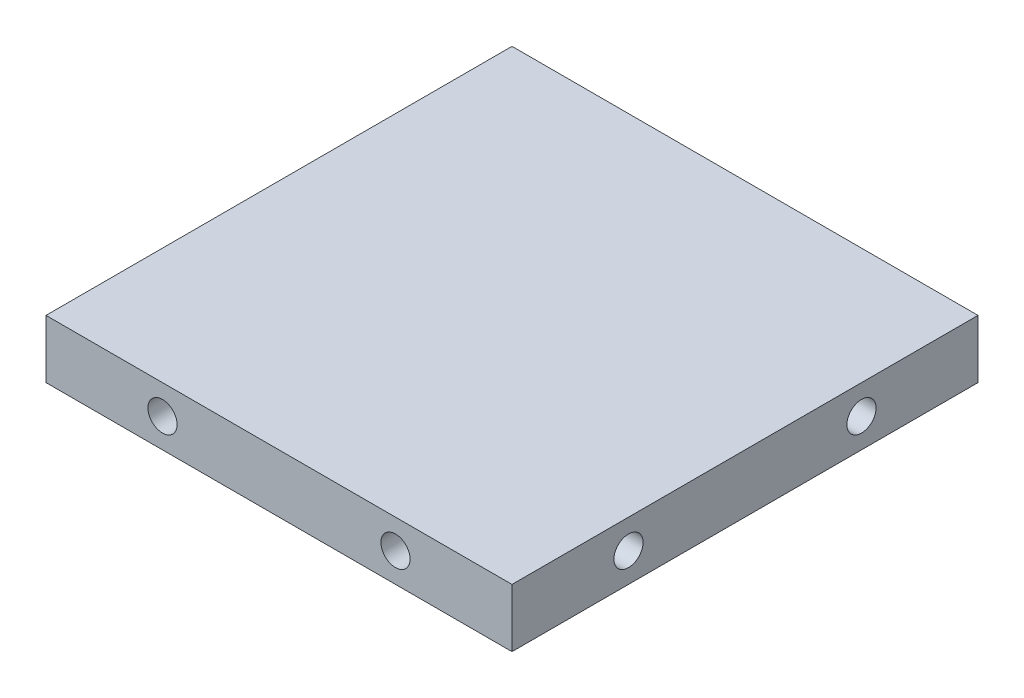
ISO-10303-21;
HEADER;
FILE_DESCRIPTION(('STEP AP214'),'2;1');
FILE_NAME('part.step','',(''),(''),'','','');
FILE_SCHEMA(('AUTOMOTIVE_DESIGN { 1 0 10303 214 1 1 1 1 }'));
ENDSEC;
DATA;
#1=APPLICATION_CONTEXT('core data for automotive mechanical design processes');
#2=APPLICATION_PROTOCOL_DEFINITION('international standard','automotive_design',2000,#1);
#3=PRODUCT_CONTEXT('',#1,'mechanical');
#4=PRODUCT('Part','Part','',(#3));
#5=PRODUCT_RELATED_PRODUCT_CATEGORY('part','',(#4));
#6=PRODUCT_DEFINITION_FORMATION('','',#4);
#7=PRODUCT_DEFINITION_CONTEXT('part definition',#1,'design');
#8=PRODUCT_DEFINITION('design','',#6,#7);
#9=PRODUCT_DEFINITION_SHAPE('','',#8);
#10=(LENGTH_UNIT() NAMED_UNIT(*) SI_UNIT(.MILLI.,.METRE.));
#11=(NAMED_UNIT(*) PLANE_ANGLE_UNIT() SI_UNIT($,.RADIAN.));
#12=(NAMED_UNIT(*) SI_UNIT($,.STERADIAN.) SOLID_ANGLE_UNIT());
#13=UNCERTAINTY_MEASURE_WITH_UNIT(LENGTH_MEASURE(1.E-05),#10,'distance_accuracy_value','');
#14=(GEOMETRIC_REPRESENTATION_CONTEXT(3) GLOBAL_UNCERTAINTY_ASSIGNED_CONTEXT((#13)) GLOBAL_UNIT_ASSIGNED_CONTEXT((#10,
#11,#12)) REPRESENTATION_CONTEXT('',''));
#15=CARTESIAN_POINT('',(0.,0.,0.));
#16=DIRECTION('',(0.,0.,1.));
#17=DIRECTION('',(1.,0.,0.));
#18=AXIS2_PLACEMENT_3D('',#15,#16,#17);
#19=CARTESIAN_POINT('',(20.,5.,20.));
#20=DIRECTION('',(-1.,0.,0.));
#21=DIRECTION('',(0.,0.,1.));
#22=AXIS2_PLACEMENT_3D('',#19,#20,#21);
#23=PLANE('',#22);
#24=CARTESIAN_POINT('',(20.,2.5,-10.0000000000001));
#25=DIRECTION('',(1.,0.,0.));
#26=DIRECTION('',(0.,0.,1.));
#27=AXIS2_PLACEMENT_3D('',#24,#25,#26);
#28=CIRCLE('',#27,1.25);
#29=CARTESIAN_POINT('',(20.,2.5,-8.75000000000007));
#30=VERTEX_POINT('',#29);
#31=EDGE_CURVE('E190',#30,#30,#28,.T.);
#32=ORIENTED_EDGE('',*,*,#31,.F.);
#33=EDGE_LOOP('',(#32));
#34=FACE_BOUND('',#33,.T.);
#35=CARTESIAN_POINT('',(20.,2.5,9.99999999999993));
#36=DIRECTION('',(1.,0.,0.));
#37=DIRECTION('',(0.,0.,-1.));
#38=AXIS2_PLACEMENT_3D('',#35,#36,#37);
#39=CIRCLE('',#38,1.25);
#40=CARTESIAN_POINT('',(20.,2.5,8.74999999999993));
#41=VERTEX_POINT('',#40);
#42=EDGE_CURVE('E150',#41,#41,#39,.T.);
#43=ORIENTED_EDGE('',*,*,#42,.F.);
#44=EDGE_LOOP('',(#43));
#45=FACE_BOUND('',#44,.T.);
#46=DIRECTION('',(0.,0.,-1.));
#47=VECTOR('',#46,1.);
#48=CARTESIAN_POINT('',(20.,0.,20.));
#49=LINE('',#48,#47);
#50=CARTESIAN_POINT('',(20.,0.,20.));
#51=VERTEX_POINT('',#50);
#52=CARTESIAN_POINT('',(20.,0.,-20.));
#53=VERTEX_POINT('',#52);
#54=EDGE_CURVE('E113',#51,#53,#49,.T.);
#55=ORIENTED_EDGE('',*,*,#54,.T.);
#56=DIRECTION('',(0.,-1.,0.));
#57=VECTOR('',#56,1.);
#58=CARTESIAN_POINT('',(20.,5.,-20.));
#59=LINE('',#58,#57);
#60=CARTESIAN_POINT('',(20.,5.,-20.));
#61=VERTEX_POINT('',#60);
#62=EDGE_CURVE('E11',#61,#53,#59,.T.);
#63=ORIENTED_EDGE('',*,*,#62,.F.);
#64=DIRECTION('',(0.,0.,-1.));
#65=VECTOR('',#64,1.);
#66=CARTESIAN_POINT('',(20.,5.,20.));
#67=LINE('',#66,#65);
#68=CARTESIAN_POINT('',(20.,5.,20.));
#69=VERTEX_POINT('',#68);
#70=EDGE_CURVE('E97',#69,#61,#67,.T.);
#71=ORIENTED_EDGE('',*,*,#70,.F.);
#72=DIRECTION('',(0.,-1.,0.));
#73=VECTOR('',#72,1.);
#74=CARTESIAN_POINT('',(20.,5.,20.));
#75=LINE('',#74,#73);
#76=EDGE_CURVE('E109',#69,#51,#75,.T.);
#77=ORIENTED_EDGE('',*,*,#76,.T.);
#78=EDGE_LOOP('',(#55,#63,#71,#77));
#79=FACE_BOUND('',#78,.T.);
#80=ADVANCED_FACE('F45',(#34,#45,#79),#23,.F.);
#81=CARTESIAN_POINT('',(-20.,5.,-20.));
#82=DIRECTION('',(0.,0.,1.));
#83=DIRECTION('',(1.,0.,0.));
#84=AXIS2_PLACEMENT_3D('',#81,#82,#83);
#85=PLANE('',#84);
#86=CARTESIAN_POINT('',(-10.,2.5,-20.));
#87=DIRECTION('',(0.,0.,-1.));
#88=DIRECTION('',(1.,0.,0.));
#89=AXIS2_PLACEMENT_3D('',#86,#87,#88);
#90=CIRCLE('',#89,1.25);
#91=CARTESIAN_POINT('',(-8.75,2.5,-20.));
#92=VERTEX_POINT('',#91);
#93=EDGE_CURVE('E174',#92,#92,#90,.T.);
#94=ORIENTED_EDGE('',*,*,#93,.F.);
#95=EDGE_LOOP('',(#94));
#96=FACE_BOUND('',#95,.T.);
#97=CARTESIAN_POINT('',(10.,2.5,-20.));
#98=DIRECTION('',(0.,0.,-1.));
#99=DIRECTION('',(-1.,0.,0.));
#100=AXIS2_PLACEMENT_3D('',#97,#98,#99);
#101=CIRCLE('',#100,1.25);
#102=CARTESIAN_POINT('',(8.75,2.5,-20.));
#103=VERTEX_POINT('',#102);
#104=EDGE_CURVE('E182',#103,#103,#101,.T.);
#105=ORIENTED_EDGE('',*,*,#104,.F.);
#106=EDGE_LOOP('',(#105));
#107=FACE_BOUND('',#106,.T.);
#108=DIRECTION('',(-1.,0.,0.));
#109=VECTOR('',#108,1.);
#110=CARTESIAN_POINT('',(-20.,0.,-20.));
#111=LINE('',#110,#109);
#112=CARTESIAN_POINT('',(-20.,0.,-20.));
#113=VERTEX_POINT('',#112);
#114=EDGE_CURVE('E102',#53,#113,#111,.T.);
#115=ORIENTED_EDGE('',*,*,#114,.T.);
#116=DIRECTION('',(0.,-1.,0.));
#117=VECTOR('',#116,1.);
#118=CARTESIAN_POINT('',(-20.,5.,-20.));
#119=LINE('',#118,#117);
#120=CARTESIAN_POINT('',(-20.,5.,-20.));
#121=VERTEX_POINT('',#120);
#122=EDGE_CURVE('E54',#121,#113,#119,.T.);
#123=ORIENTED_EDGE('',*,*,#122,.F.);
#124=DIRECTION('',(-1.,0.,0.));
#125=VECTOR('',#124,1.);
#126=CARTESIAN_POINT('',(-20.,5.,-20.));
#127=LINE('',#126,#125);
#128=EDGE_CURVE('E92',#61,#121,#127,.T.);
#129=ORIENTED_EDGE('',*,*,#128,.F.);
#130=ORIENTED_EDGE('',*,*,#62,.T.);
#131=EDGE_LOOP('',(#115,#123,#129,#130));
#132=FACE_BOUND('',#131,.T.);
#133=ADVANCED_FACE('F101',(#96,#107,#132),#85,.F.);
#134=CARTESIAN_POINT('',(-20.,5.,20.));
#135=DIRECTION('',(1.,0.,0.));
#136=DIRECTION('',(0.,0.,-1.));
#137=AXIS2_PLACEMENT_3D('',#134,#135,#136);
#138=PLANE('',#137);
#139=CARTESIAN_POINT('',(-19.9999999999999,2.5,10.0000000000002));
#140=DIRECTION('',(-1.,0.,0.));
#141=DIRECTION('',(0.,0.,-1.));
#142=AXIS2_PLACEMENT_3D('',#139,#140,#141);
#143=CIRCLE('',#142,1.25);
#144=CARTESIAN_POINT('',(-19.9999999999999,2.5,8.75000000000021));
#145=VERTEX_POINT('',#144);
#146=EDGE_CURVE('E158',#145,#145,#143,.T.);
#147=ORIENTED_EDGE('',*,*,#146,.F.);
#148=EDGE_LOOP('',(#147));
#149=FACE_BOUND('',#148,.T.);
#150=CARTESIAN_POINT('',(-20.0000000000001,2.5,-9.99999999999979));
#151=DIRECTION('',(-1.,0.,0.));
#152=DIRECTION('',(0.,0.,1.));
#153=AXIS2_PLACEMENT_3D('',#150,#151,#152);
#154=CIRCLE('',#153,1.25);
#155=CARTESIAN_POINT('',(-20.0000000000001,2.5,-8.74999999999979));
#156=VERTEX_POINT('',#155);
#157=EDGE_CURVE('E166',#156,#156,#154,.T.);
#158=ORIENTED_EDGE('',*,*,#157,.F.);
#159=EDGE_LOOP('',(#158));
#160=FACE_BOUND('',#159,.T.);
#161=DIRECTION('',(0.,0.,1.));
#162=VECTOR('',#161,1.);
#163=CARTESIAN_POINT('',(-20.,0.,20.));
#164=LINE('',#163,#162);
#165=CARTESIAN_POINT('',(-20.,0.,20.));
#166=VERTEX_POINT('',#165);
#167=EDGE_CURVE('E79',#113,#166,#164,.T.);
#168=ORIENTED_EDGE('',*,*,#167,.T.);
#169=DIRECTION('',(0.,-1.,0.));
#170=VECTOR('',#169,1.);
#171=CARTESIAN_POINT('',(-20.,5.,20.));
#172=LINE('',#171,#170);
#173=CARTESIAN_POINT('',(-20.,5.,20.));
#174=VERTEX_POINT('',#173);
#175=EDGE_CURVE('E104',#174,#166,#172,.T.);
#176=ORIENTED_EDGE('',*,*,#175,.F.);
#177=DIRECTION('',(0.,0.,1.));
#178=VECTOR('',#177,1.);
#179=CARTESIAN_POINT('',(-20.,5.,20.));
#180=LINE('',#179,#178);
#181=EDGE_CURVE('E95',#121,#174,#180,.T.);
#182=ORIENTED_EDGE('',*,*,#181,.F.);
#183=ORIENTED_EDGE('',*,*,#122,.T.);
#184=EDGE_LOOP('',(#168,#176,#182,#183));
#185=FACE_BOUND('',#184,.T.);
#186=ADVANCED_FACE('F105',(#149,#160,#185),#138,.F.);
#187=CARTESIAN_POINT('',(-20.,5.,20.));
#188=DIRECTION('',(0.,0.,-1.));
#189=DIRECTION('',(-1.,0.,0.));
#190=AXIS2_PLACEMENT_3D('',#187,#188,#189);
#191=PLANE('',#190);
#192=CARTESIAN_POINT('',(-10.,2.5,20.));
#193=DIRECTION('',(0.,0.,1.));
#194=DIRECTION('',(1.,0.,0.));
#195=AXIS2_PLACEMENT_3D('',#192,#193,#194);
#196=CIRCLE('',#195,1.25);
#197=CARTESIAN_POINT('',(-8.75,2.5,20.));
#198=VERTEX_POINT('',#197);
#199=EDGE_CURVE('E143',#198,#198,#196,.T.);
#200=ORIENTED_EDGE('',*,*,#199,.F.);
#201=EDGE_LOOP('',(#200));
#202=FACE_BOUND('',#201,.T.);
#203=CARTESIAN_POINT('',(10.,2.5,20.));
#204=DIRECTION('',(0.,0.,1.));
#205=DIRECTION('',(-1.,0.,0.));
#206=AXIS2_PLACEMENT_3D('',#203,#204,#205);
#207=CIRCLE('',#206,1.25);
#208=CARTESIAN_POINT('',(8.75,2.5,20.));
#209=VERTEX_POINT('',#208);
#210=EDGE_CURVE('E138',#209,#209,#207,.T.);
#211=ORIENTED_EDGE('',*,*,#210,.F.);
#212=EDGE_LOOP('',(#211));
#213=FACE_BOUND('',#212,.T.);
#214=DIRECTION('',(1.,0.,0.));
#215=VECTOR('',#214,1.);
#216=CARTESIAN_POINT('',(-20.,0.,20.));
#217=LINE('',#216,#215);
#218=EDGE_CURVE('E85',#166,#51,#217,.T.);
#219=ORIENTED_EDGE('',*,*,#218,.T.);
#220=ORIENTED_EDGE('',*,*,#76,.F.);
#221=DIRECTION('',(1.,0.,0.));
#222=VECTOR('',#221,1.);
#223=CARTESIAN_POINT('',(-20.,5.,20.));
#224=LINE('',#223,#222);
#225=EDGE_CURVE('E62',#174,#69,#224,.T.);
#226=ORIENTED_EDGE('',*,*,#225,.F.);
#227=ORIENTED_EDGE('',*,*,#175,.T.);
#228=EDGE_LOOP('',(#219,#220,#226,#227));
#229=FACE_BOUND('',#228,.T.);
#230=ADVANCED_FACE('F127',(#202,#213,#229),#191,.F.);
#231=CARTESIAN_POINT('',(0.,5.,0.));
#232=DIRECTION('',(0.,-1.,0.));
#233=DIRECTION('',(0.,0.,-1.));
#234=AXIS2_PLACEMENT_3D('',#231,#232,#233);
#235=PLANE('',#234);
#236=ORIENTED_EDGE('',*,*,#70,.T.);
#237=ORIENTED_EDGE('',*,*,#128,.T.);
#238=ORIENTED_EDGE('',*,*,#181,.T.);
#239=ORIENTED_EDGE('',*,*,#225,.T.);
#240=EDGE_LOOP('',(#236,#237,#238,#239));
#241=FACE_BOUND('',#240,.T.);
#242=ADVANCED_FACE('F93',(#241),#235,.F.);
#243=CARTESIAN_POINT('',(0.,0.,0.));
#244=DIRECTION('',(0.,-1.,0.));
#245=DIRECTION('',(0.,0.,-1.));
#246=AXIS2_PLACEMENT_3D('',#243,#244,#245);
#247=PLANE('',#246);
#248=ORIENTED_EDGE('',*,*,#54,.F.);
#249=ORIENTED_EDGE('',*,*,#218,.F.);
#250=ORIENTED_EDGE('',*,*,#167,.F.);
#251=ORIENTED_EDGE('',*,*,#114,.F.);
#252=EDGE_LOOP('',(#248,#249,#250,#251));
#253=FACE_BOUND('',#252,.T.);
#254=ADVANCED_FACE('F130',(#253),#247,.T.);
#255=CARTESIAN_POINT('',(10.,2.5,15.));
#256=DIRECTION('',(0.,0.,1.));
#257=DIRECTION('',(1.,0.,0.));
#258=AXIS2_PLACEMENT_3D('',#255,#256,#257);
#259=CYLINDRICAL_SURFACE('',#258,1.25);
#260=CARTESIAN_POINT('',(10.,2.5,15.));
#261=DIRECTION('',(0.,0.,1.));
#262=DIRECTION('',(-1.,0.,0.));
#263=AXIS2_PLACEMENT_3D('',#260,#261,#262);
#264=CIRCLE('',#263,1.25);
#265=CARTESIAN_POINT('',(8.75,2.5,15.));
#266=VERTEX_POINT('',#265);
#267=EDGE_CURVE('E134',#266,#266,#264,.T.);
#268=ORIENTED_EDGE('',*,*,#267,.F.);
#269=EDGE_LOOP('',(#268));
#270=FACE_BOUND('',#269,.T.);
#271=ORIENTED_EDGE('',*,*,#210,.T.);
#272=EDGE_LOOP('',(#271));
#273=FACE_BOUND('',#272,.T.);
#274=ADVANCED_FACE('F238',(#270,#273),#259,.F.);
#275=CARTESIAN_POINT('',(10.,2.5,15.));
#276=DIRECTION('',(0.,0.,-1.));
#277=DIRECTION('',(-1.,0.,0.));
#278=AXIS2_PLACEMENT_3D('',#275,#276,#277);
#279=PLANE('',#278);
#280=ORIENTED_EDGE('',*,*,#267,.T.);
#281=EDGE_LOOP('',(#280));
#282=FACE_BOUND('',#281,.T.);
#283=ADVANCED_FACE('F236',(#282),#279,.F.);
#284=CARTESIAN_POINT('',(-10.,2.5,15.));
#285=DIRECTION('',(0.,0.,1.));
#286=DIRECTION('',(1.,0.,0.));
#287=AXIS2_PLACEMENT_3D('',#284,#285,#286);
#288=CYLINDRICAL_SURFACE('',#287,1.25);
#289=CARTESIAN_POINT('',(-10.,2.5,15.));
#290=DIRECTION('',(0.,0.,1.));
#291=DIRECTION('',(1.,0.,0.));
#292=AXIS2_PLACEMENT_3D('',#289,#290,#291);
#293=CIRCLE('',#292,1.25);
#294=CARTESIAN_POINT('',(-8.75,2.5,15.));
#295=VERTEX_POINT('',#294);
#296=EDGE_CURVE('E117',#295,#295,#293,.T.);
#297=ORIENTED_EDGE('',*,*,#296,.F.);
#298=EDGE_LOOP('',(#297));
#299=FACE_BOUND('',#298,.T.);
#300=ORIENTED_EDGE('',*,*,#199,.T.);
#301=EDGE_LOOP('',(#300));
#302=FACE_BOUND('',#301,.T.);
#303=ADVANCED_FACE('F232',(#299,#302),#288,.F.);
#304=CARTESIAN_POINT('',(-10.,2.5,15.));
#305=DIRECTION('',(0.,0.,1.));
#306=DIRECTION('',(1.,0.,0.));
#307=AXIS2_PLACEMENT_3D('',#304,#305,#306);
#308=PLANE('',#307);
#309=ORIENTED_EDGE('',*,*,#296,.T.);
#310=EDGE_LOOP('',(#309));
#311=FACE_BOUND('',#310,.T.);
#312=ADVANCED_FACE('F228',(#311),#308,.T.);
#313=CARTESIAN_POINT('',(-15.0000000000001,2.5,-9.99999999999984));
#314=DIRECTION('',(-1.,0.,0.));
#315=DIRECTION('',(0.,0.,1.));
#316=AXIS2_PLACEMENT_3D('',#313,#314,#315);
#317=CYLINDRICAL_SURFACE('',#316,1.25);
#318=CARTESIAN_POINT('',(-15.0000000000001,2.5,-9.99999999999984));
#319=DIRECTION('',(-1.,0.,0.));
#320=DIRECTION('',(0.,0.,1.));
#321=AXIS2_PLACEMENT_3D('',#318,#319,#320);
#322=CIRCLE('',#321,1.25);
#323=CARTESIAN_POINT('',(-15.0000000000001,2.5,-8.74999999999984));
#324=VERTEX_POINT('',#323);
#325=EDGE_CURVE('E170',#324,#324,#322,.T.);
#326=ORIENTED_EDGE('',*,*,#325,.F.);
#327=EDGE_LOOP('',(#326));
#328=FACE_BOUND('',#327,.T.);
#329=ORIENTED_EDGE('',*,*,#157,.T.);
#330=EDGE_LOOP('',(#329));
#331=FACE_BOUND('',#330,.T.);
#332=ADVANCED_FACE('F231',(#328,#331),#317,.F.);
#333=CARTESIAN_POINT('',(-15.0000000000001,2.5,-9.99999999999984));
#334=DIRECTION('',(-1.,0.,0.));
#335=DIRECTION('',(0.,0.,1.));
#336=AXIS2_PLACEMENT_3D('',#333,#334,#335);
#337=PLANE('',#336);
#338=ORIENTED_EDGE('',*,*,#325,.T.);
#339=EDGE_LOOP('',(#338));
#340=FACE_BOUND('',#339,.T.);
#341=ADVANCED_FACE('F282',(#340),#337,.T.);
#342=CARTESIAN_POINT('',(-14.9999999999999,2.5,10.0000000000002));
#343=DIRECTION('',(-1.,0.,0.));
#344=DIRECTION('',(0.,0.,1.));
#345=AXIS2_PLACEMENT_3D('',#342,#343,#344);
#346=CYLINDRICAL_SURFACE('',#345,1.25);
#347=CARTESIAN_POINT('',(-14.9999999999999,2.5,10.0000000000002));
#348=DIRECTION('',(-1.,0.,0.));
#349=DIRECTION('',(0.,0.,-1.));
#350=AXIS2_PLACEMENT_3D('',#347,#348,#349);
#351=CIRCLE('',#350,1.25);
#352=CARTESIAN_POINT('',(-14.9999999999999,2.5,8.75000000000016));
#353=VERTEX_POINT('',#352);
#354=EDGE_CURVE('E162',#353,#353,#351,.T.);
#355=ORIENTED_EDGE('',*,*,#354,.F.);
#356=EDGE_LOOP('',(#355));
#357=FACE_BOUND('',#356,.T.);
#358=ORIENTED_EDGE('',*,*,#146,.T.);
#359=EDGE_LOOP('',(#358));
#360=FACE_BOUND('',#359,.T.);
#361=ADVANCED_FACE('F274',(#357,#360),#346,.F.);
#362=CARTESIAN_POINT('',(-14.9999999999999,2.5,10.0000000000002));
#363=DIRECTION('',(1.,0.,0.));
#364=DIRECTION('',(0.,0.,-1.));
#365=AXIS2_PLACEMENT_3D('',#362,#363,#364);
#366=PLANE('',#365);
#367=ORIENTED_EDGE('',*,*,#354,.T.);
#368=EDGE_LOOP('',(#367));
#369=FACE_BOUND('',#368,.T.);
#370=ADVANCED_FACE('F265',(#369),#366,.F.);
#371=CARTESIAN_POINT('',(10.,2.5,-15.));
#372=DIRECTION('',(0.,0.,-1.));
#373=DIRECTION('',(-1.,0.,0.));
#374=AXIS2_PLACEMENT_3D('',#371,#372,#373);
#375=CYLINDRICAL_SURFACE('',#374,1.25);
#376=CARTESIAN_POINT('',(10.,2.5,-15.));
#377=DIRECTION('',(0.,0.,-1.));
#378=DIRECTION('',(-1.,0.,0.));
#379=AXIS2_PLACEMENT_3D('',#376,#377,#378);
#380=CIRCLE('',#379,1.25);
#381=CARTESIAN_POINT('',(8.75,2.5,-15.));
#382=VERTEX_POINT('',#381);
#383=EDGE_CURVE('E186',#382,#382,#380,.T.);
#384=ORIENTED_EDGE('',*,*,#383,.F.);
#385=EDGE_LOOP('',(#384));
#386=FACE_BOUND('',#385,.T.);
#387=ORIENTED_EDGE('',*,*,#104,.T.);
#388=EDGE_LOOP('',(#387));
#389=FACE_BOUND('',#388,.T.);
#390=ADVANCED_FACE('F262',(#386,#389),#375,.F.);
#391=CARTESIAN_POINT('',(10.,2.5,-15.));
#392=DIRECTION('',(0.,0.,-1.));
#393=DIRECTION('',(-1.,0.,0.));
#394=AXIS2_PLACEMENT_3D('',#391,#392,#393);
#395=PLANE('',#394);
#396=ORIENTED_EDGE('',*,*,#383,.T.);
#397=EDGE_LOOP('',(#396));
#398=FACE_BOUND('',#397,.T.);
#399=ADVANCED_FACE('F264',(#398),#395,.T.);
#400=CARTESIAN_POINT('',(-10.,2.5,-15.));
#401=DIRECTION('',(0.,0.,-1.));
#402=DIRECTION('',(-1.,0.,0.));
#403=AXIS2_PLACEMENT_3D('',#400,#401,#402);
#404=CYLINDRICAL_SURFACE('',#403,1.25);
#405=CARTESIAN_POINT('',(-10.,2.5,-15.));
#406=DIRECTION('',(0.,0.,-1.));
#407=DIRECTION('',(1.,0.,0.));
#408=AXIS2_PLACEMENT_3D('',#405,#406,#407);
#409=CIRCLE('',#408,1.25);
#410=CARTESIAN_POINT('',(-8.75,2.5,-15.));
#411=VERTEX_POINT('',#410);
#412=EDGE_CURVE('E178',#411,#411,#409,.T.);
#413=ORIENTED_EDGE('',*,*,#412,.F.);
#414=EDGE_LOOP('',(#413));
#415=FACE_BOUND('',#414,.T.);
#416=ORIENTED_EDGE('',*,*,#93,.T.);
#417=EDGE_LOOP('',(#416));
#418=FACE_BOUND('',#417,.T.);
#419=ADVANCED_FACE('F222',(#415,#418),#404,.F.);
#420=CARTESIAN_POINT('',(-10.,2.5,-15.));
#421=DIRECTION('',(0.,0.,1.));
#422=DIRECTION('',(1.,0.,0.));
#423=AXIS2_PLACEMENT_3D('',#420,#421,#422);
#424=PLANE('',#423);
#425=ORIENTED_EDGE('',*,*,#412,.T.);
#426=EDGE_LOOP('',(#425));
#427=FACE_BOUND('',#426,.T.);
#428=ADVANCED_FACE('F213',(#427),#424,.F.);
#429=CARTESIAN_POINT('',(15.,2.5,9.99999999999995));
#430=DIRECTION('',(1.,0.,0.));
#431=DIRECTION('',(0.,0.,-1.));
#432=AXIS2_PLACEMENT_3D('',#429,#430,#431);
#433=CYLINDRICAL_SURFACE('',#432,1.25);
#434=CARTESIAN_POINT('',(15.,2.5,9.99999999999995));
#435=DIRECTION('',(1.,0.,0.));
#436=DIRECTION('',(0.,0.,-1.));
#437=AXIS2_PLACEMENT_3D('',#434,#435,#436);
#438=CIRCLE('',#437,1.25);
#439=CARTESIAN_POINT('',(15.,2.5,8.74999999999995));
#440=VERTEX_POINT('',#439);
#441=EDGE_CURVE('E139',#440,#440,#438,.T.);
#442=ORIENTED_EDGE('',*,*,#441,.F.);
#443=EDGE_LOOP('',(#442));
#444=FACE_BOUND('',#443,.T.);
#445=ORIENTED_EDGE('',*,*,#42,.T.);
#446=EDGE_LOOP('',(#445));
#447=FACE_BOUND('',#446,.T.);
#448=ADVANCED_FACE('F211',(#444,#447),#433,.F.);
#449=CARTESIAN_POINT('',(15.,2.5,9.99999999999995));
#450=DIRECTION('',(1.,0.,0.));
#451=DIRECTION('',(0.,0.,-1.));
#452=AXIS2_PLACEMENT_3D('',#449,#450,#451);
#453=PLANE('',#452);
#454=ORIENTED_EDGE('',*,*,#441,.T.);
#455=EDGE_LOOP('',(#454));
#456=FACE_BOUND('',#455,.T.);
#457=ADVANCED_FACE('F203',(#456),#453,.T.);
#458=CARTESIAN_POINT('',(15.,2.5,-10.0000000000001));
#459=DIRECTION('',(1.,0.,0.));
#460=DIRECTION('',(0.,0.,-1.));
#461=AXIS2_PLACEMENT_3D('',#458,#459,#460);
#462=CYLINDRICAL_SURFACE('',#461,1.25);
#463=CARTESIAN_POINT('',(15.,2.5,-10.0000000000001));
#464=DIRECTION('',(1.,0.,0.));
#465=DIRECTION('',(0.,0.,1.));
#466=AXIS2_PLACEMENT_3D('',#463,#464,#465);
#467=CIRCLE('',#466,1.25);
#468=CARTESIAN_POINT('',(15.,2.5,-8.75000000000005));
#469=VERTEX_POINT('',#468);
#470=EDGE_CURVE('E154',#469,#469,#467,.T.);
#471=ORIENTED_EDGE('',*,*,#470,.F.);
#472=EDGE_LOOP('',(#471));
#473=FACE_BOUND('',#472,.T.);
#474=ORIENTED_EDGE('',*,*,#31,.T.);
#475=EDGE_LOOP('',(#474));
#476=FACE_BOUND('',#475,.T.);
#477=ADVANCED_FACE('F200',(#473,#476),#462,.F.);
#478=CARTESIAN_POINT('',(15.,2.5,-10.0000000000001));
#479=DIRECTION('',(-1.,0.,0.));
#480=DIRECTION('',(0.,0.,1.));
#481=AXIS2_PLACEMENT_3D('',#478,#479,#480);
#482=PLANE('',#481);
#483=ORIENTED_EDGE('',*,*,#470,.T.);
#484=EDGE_LOOP('',(#483));
#485=FACE_BOUND('',#484,.T.);
#486=ADVANCED_FACE('F198',(#485),#482,.F.);
#487=CLOSED_SHELL('',(#80,#133,#186,#230,#242,#254,#274,#283,#303,#312,#332,#341,#361,#370,#390,
#399,#419,#428,#448,#457,#477,#486));
#488=MANIFOLD_SOLID_BREP('B2',#487);
#489=ADVANCED_BREP_SHAPE_REPRESENTATION('',(#18,#488),#14);
#490=SHAPE_DEFINITION_REPRESENTATION(#9,#489);
ENDSEC;
END-ISO-10303-21;
